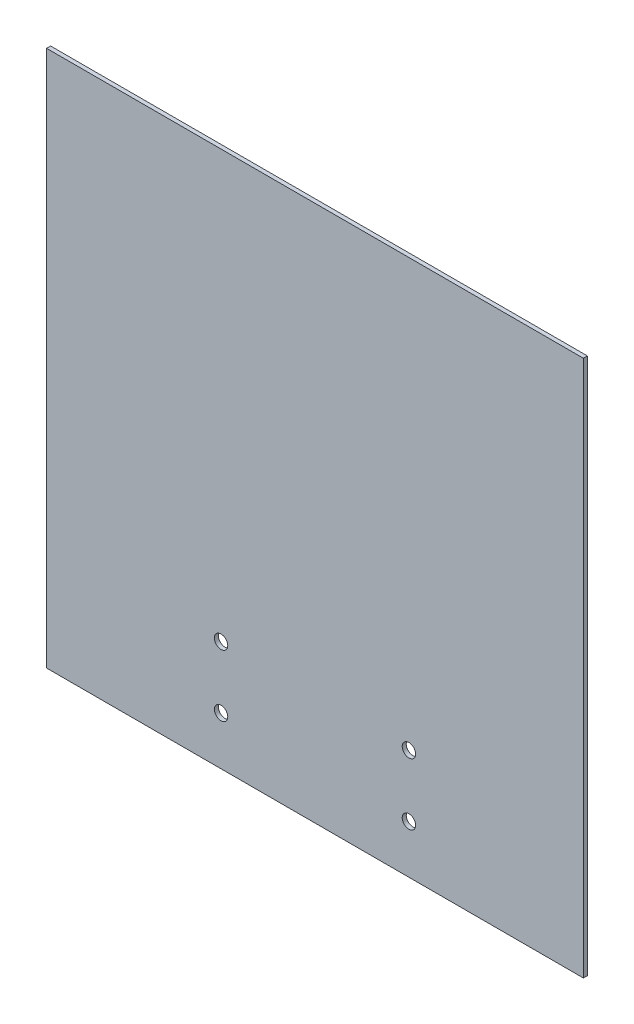
ISO-10303-21;
HEADER;
FILE_DESCRIPTION(('STEP AP214'),'2;1');
FILE_NAME('part.step','',(''),(''),'','','');
FILE_SCHEMA(('AUTOMOTIVE_DESIGN { 1 0 10303 214 1 1 1 1 }'));
ENDSEC;
DATA;
#1=APPLICATION_CONTEXT('core data for automotive mechanical design processes');
#2=APPLICATION_PROTOCOL_DEFINITION('international standard','automotive_design',2000,#1);
#3=PRODUCT_CONTEXT('',#1,'mechanical');
#4=PRODUCT('Part','Part','',(#3));
#5=PRODUCT_RELATED_PRODUCT_CATEGORY('part','',(#4));
#6=PRODUCT_DEFINITION_FORMATION('','',#4);
#7=PRODUCT_DEFINITION_CONTEXT('part definition',#1,'design');
#8=PRODUCT_DEFINITION('design','',#6,#7);
#9=PRODUCT_DEFINITION_SHAPE('','',#8);
#10=(LENGTH_UNIT() NAMED_UNIT(*) SI_UNIT(.MILLI.,.METRE.));
#11=(NAMED_UNIT(*) PLANE_ANGLE_UNIT() SI_UNIT($,.RADIAN.));
#12=(NAMED_UNIT(*) SI_UNIT($,.STERADIAN.) SOLID_ANGLE_UNIT());
#13=UNCERTAINTY_MEASURE_WITH_UNIT(LENGTH_MEASURE(1.E-05),#10,'distance_accuracy_value','');
#14=(GEOMETRIC_REPRESENTATION_CONTEXT(3) GLOBAL_UNCERTAINTY_ASSIGNED_CONTEXT((#13)) GLOBAL_UNIT_ASSIGNED_CONTEXT((#10,
#11,#12)) REPRESENTATION_CONTEXT('',''));
#15=CARTESIAN_POINT('',(0.,0.,0.));
#16=DIRECTION('',(0.,0.,1.));
#17=DIRECTION('',(1.,0.,0.));
#18=AXIS2_PLACEMENT_3D('',#15,#16,#17);
#19=CARTESIAN_POINT('',(100.,-100.,1.5));
#20=DIRECTION('',(-1.,0.,0.));
#21=DIRECTION('',(0.,0.,1.));
#22=AXIS2_PLACEMENT_3D('',#19,#20,#21);
#23=PLANE('',#22);
#24=DIRECTION('',(0.,1.,0.));
#25=VECTOR('',#24,1.);
#26=CARTESIAN_POINT('',(100.,-100.,0.));
#27=LINE('',#26,#25);
#28=CARTESIAN_POINT('',(100.,-100.,0.));
#29=VERTEX_POINT('',#28);
#30=CARTESIAN_POINT('',(100.,100.,0.));
#31=VERTEX_POINT('',#30);
#32=EDGE_CURVE('E106',#29,#31,#27,.T.);
#33=ORIENTED_EDGE('',*,*,#32,.T.);
#34=DIRECTION('',(0.,0.,-1.));
#35=VECTOR('',#34,1.);
#36=CARTESIAN_POINT('',(100.,100.,1.5));
#37=LINE('',#36,#35);
#38=CARTESIAN_POINT('',(100.,100.,1.5));
#39=VERTEX_POINT('',#38);
#40=EDGE_CURVE('E11',#39,#31,#37,.T.);
#41=ORIENTED_EDGE('',*,*,#40,.F.);
#42=DIRECTION('',(0.,1.,0.));
#43=VECTOR('',#42,1.);
#44=CARTESIAN_POINT('',(100.,-100.,1.5));
#45=LINE('',#44,#43);
#46=CARTESIAN_POINT('',(100.,-100.,1.5));
#47=VERTEX_POINT('',#46);
#48=EDGE_CURVE('E90',#47,#39,#45,.T.);
#49=ORIENTED_EDGE('',*,*,#48,.F.);
#50=DIRECTION('',(0.,0.,-1.));
#51=VECTOR('',#50,1.);
#52=CARTESIAN_POINT('',(100.,-100.,1.5));
#53=LINE('',#52,#51);
#54=EDGE_CURVE('E102',#47,#29,#53,.T.);
#55=ORIENTED_EDGE('',*,*,#54,.T.);
#56=EDGE_LOOP('',(#33,#41,#49,#55));
#57=FACE_BOUND('',#56,.T.);
#58=ADVANCED_FACE('F38',(#57),#23,.F.);
#59=CARTESIAN_POINT('',(-100.,100.,1.5));
#60=DIRECTION('',(0.,-1.,0.));
#61=DIRECTION('',(0.,0.,-1.));
#62=AXIS2_PLACEMENT_3D('',#59,#60,#61);
#63=PLANE('',#62);
#64=DIRECTION('',(-1.,0.,0.));
#65=VECTOR('',#64,1.);
#66=CARTESIAN_POINT('',(-100.,100.,0.));
#67=LINE('',#66,#65);
#68=CARTESIAN_POINT('',(-100.,100.,0.));
#69=VERTEX_POINT('',#68);
#70=EDGE_CURVE('E95',#31,#69,#67,.T.);
#71=ORIENTED_EDGE('',*,*,#70,.T.);
#72=DIRECTION('',(0.,0.,-1.));
#73=VECTOR('',#72,1.);
#74=CARTESIAN_POINT('',(-100.,100.,1.5));
#75=LINE('',#74,#73);
#76=CARTESIAN_POINT('',(-100.,100.,1.5));
#77=VERTEX_POINT('',#76);
#78=EDGE_CURVE('E47',#77,#69,#75,.T.);
#79=ORIENTED_EDGE('',*,*,#78,.F.);
#80=DIRECTION('',(-1.,0.,0.));
#81=VECTOR('',#80,1.);
#82=CARTESIAN_POINT('',(-100.,100.,1.5));
#83=LINE('',#82,#81);
#84=EDGE_CURVE('E85',#39,#77,#83,.T.);
#85=ORIENTED_EDGE('',*,*,#84,.F.);
#86=ORIENTED_EDGE('',*,*,#40,.T.);
#87=EDGE_LOOP('',(#71,#79,#85,#86));
#88=FACE_BOUND('',#87,.T.);
#89=ADVANCED_FACE('F94',(#88),#63,.F.);
#90=CARTESIAN_POINT('',(-100.,-100.,1.5));
#91=DIRECTION('',(1.,0.,0.));
#92=DIRECTION('',(0.,0.,-1.));
#93=AXIS2_PLACEMENT_3D('',#90,#91,#92);
#94=PLANE('',#93);
#95=DIRECTION('',(0.,-1.,0.));
#96=VECTOR('',#95,1.);
#97=CARTESIAN_POINT('',(-100.,-100.,0.));
#98=LINE('',#97,#96);
#99=CARTESIAN_POINT('',(-100.,-100.,0.));
#100=VERTEX_POINT('',#99);
#101=EDGE_CURVE('E72',#69,#100,#98,.T.);
#102=ORIENTED_EDGE('',*,*,#101,.T.);
#103=DIRECTION('',(0.,0.,-1.));
#104=VECTOR('',#103,1.);
#105=CARTESIAN_POINT('',(-100.,-100.,1.5));
#106=LINE('',#105,#104);
#107=CARTESIAN_POINT('',(-100.,-100.,1.5));
#108=VERTEX_POINT('',#107);
#109=EDGE_CURVE('E97',#108,#100,#106,.T.);
#110=ORIENTED_EDGE('',*,*,#109,.F.);
#111=DIRECTION('',(0.,-1.,0.));
#112=VECTOR('',#111,1.);
#113=CARTESIAN_POINT('',(-100.,-100.,1.5));
#114=LINE('',#113,#112);
#115=EDGE_CURVE('E88',#77,#108,#114,.T.);
#116=ORIENTED_EDGE('',*,*,#115,.F.);
#117=ORIENTED_EDGE('',*,*,#78,.T.);
#118=EDGE_LOOP('',(#102,#110,#116,#117));
#119=FACE_BOUND('',#118,.T.);
#120=ADVANCED_FACE('F98',(#119),#94,.F.);
#121=CARTESIAN_POINT('',(-100.,-100.,1.5));
#122=DIRECTION('',(0.,1.,0.));
#123=DIRECTION('',(0.,0.,1.));
#124=AXIS2_PLACEMENT_3D('',#121,#122,#123);
#125=PLANE('',#124);
#126=DIRECTION('',(1.,0.,0.));
#127=VECTOR('',#126,1.);
#128=CARTESIAN_POINT('',(-100.,-100.,0.));
#129=LINE('',#128,#127);
#130=EDGE_CURVE('E78',#100,#29,#129,.T.);
#131=ORIENTED_EDGE('',*,*,#130,.T.);
#132=ORIENTED_EDGE('',*,*,#54,.F.);
#133=DIRECTION('',(1.,0.,0.));
#134=VECTOR('',#133,1.);
#135=CARTESIAN_POINT('',(-100.,-100.,1.5));
#136=LINE('',#135,#134);
#137=EDGE_CURVE('E55',#108,#47,#136,.T.);
#138=ORIENTED_EDGE('',*,*,#137,.F.);
#139=ORIENTED_EDGE('',*,*,#109,.T.);
#140=EDGE_LOOP('',(#131,#132,#138,#139));
#141=FACE_BOUND('',#140,.T.);
#142=ADVANCED_FACE('F120',(#141),#125,.F.);
#143=CARTESIAN_POINT('',(0.,0.,1.5));
#144=DIRECTION('',(0.,0.,-1.));
#145=DIRECTION('',(-1.,0.,0.));
#146=AXIS2_PLACEMENT_3D('',#143,#144,#145);
#147=PLANE('',#146);
#148=CARTESIAN_POINT('',(-35.,-59.,1.5));
#149=DIRECTION('',(0.,0.,1.));
#150=DIRECTION('',(1.,0.,0.));
#151=AXIS2_PLACEMENT_3D('',#148,#149,#150);
#152=CIRCLE('',#151,2.5);
#153=CARTESIAN_POINT('',(-32.5,-59.,1.5));
#154=VERTEX_POINT('',#153);
#155=EDGE_CURVE('E144',#154,#154,#152,.T.);
#156=ORIENTED_EDGE('',*,*,#155,.F.);
#157=EDGE_LOOP('',(#156));
#158=FACE_BOUND('',#157,.T.);
#159=CARTESIAN_POINT('',(35.,-82.,1.5));
#160=DIRECTION('',(0.,0.,1.));
#161=DIRECTION('',(-1.,0.,0.));
#162=AXIS2_PLACEMENT_3D('',#159,#160,#161);
#163=CIRCLE('',#162,2.5);
#164=CARTESIAN_POINT('',(32.5,-82.,1.5));
#165=VERTEX_POINT('',#164);
#166=EDGE_CURVE('E135',#165,#165,#163,.T.);
#167=ORIENTED_EDGE('',*,*,#166,.F.);
#168=EDGE_LOOP('',(#167));
#169=FACE_BOUND('',#168,.T.);
#170=CARTESIAN_POINT('',(35.,-59.,1.5));
#171=DIRECTION('',(0.,0.,1.));
#172=DIRECTION('',(-1.,0.,0.));
#173=AXIS2_PLACEMENT_3D('',#170,#171,#172);
#174=CIRCLE('',#173,2.5);
#175=CARTESIAN_POINT('',(32.5,-59.,1.5));
#176=VERTEX_POINT('',#175);
#177=EDGE_CURVE('E151',#176,#176,#174,.T.);
#178=ORIENTED_EDGE('',*,*,#177,.F.);
#179=EDGE_LOOP('',(#178));
#180=FACE_BOUND('',#179,.T.);
#181=CARTESIAN_POINT('',(-35.,-82.,1.5));
#182=DIRECTION('',(0.,0.,1.));
#183=DIRECTION('',(1.,0.,0.));
#184=AXIS2_PLACEMENT_3D('',#181,#182,#183);
#185=CIRCLE('',#184,2.5);
#186=CARTESIAN_POINT('',(-32.5,-82.,1.5));
#187=VERTEX_POINT('',#186);
#188=EDGE_CURVE('E127',#187,#187,#185,.T.);
#189=ORIENTED_EDGE('',*,*,#188,.F.);
#190=EDGE_LOOP('',(#189));
#191=FACE_BOUND('',#190,.T.);
#192=ORIENTED_EDGE('',*,*,#48,.T.);
#193=ORIENTED_EDGE('',*,*,#84,.T.);
#194=ORIENTED_EDGE('',*,*,#115,.T.);
#195=ORIENTED_EDGE('',*,*,#137,.T.);
#196=EDGE_LOOP('',(#192,#193,#194,#195));
#197=FACE_BOUND('',#196,.T.);
#198=ADVANCED_FACE('F86',(#158,#169,#180,#191,#197),#147,.F.);
#199=CARTESIAN_POINT('',(0.,0.,0.));
#200=DIRECTION('',(0.,0.,-1.));
#201=DIRECTION('',(-1.,0.,0.));
#202=AXIS2_PLACEMENT_3D('',#199,#200,#201);
#203=PLANE('',#202);
#204=CARTESIAN_POINT('',(-35.,-59.,0.));
#205=DIRECTION('',(0.,0.,1.));
#206=DIRECTION('',(1.,0.,0.));
#207=AXIS2_PLACEMENT_3D('',#204,#205,#206);
#208=CIRCLE('',#207,2.5);
#209=CARTESIAN_POINT('',(-32.5,-59.,0.));
#210=VERTEX_POINT('',#209);
#211=EDGE_CURVE('E131',#210,#210,#208,.T.);
#212=ORIENTED_EDGE('',*,*,#211,.T.);
#213=EDGE_LOOP('',(#212));
#214=FACE_BOUND('',#213,.T.);
#215=CARTESIAN_POINT('',(35.,-82.,0.));
#216=DIRECTION('',(0.,0.,1.));
#217=DIRECTION('',(-1.,0.,0.));
#218=AXIS2_PLACEMENT_3D('',#215,#216,#217);
#219=CIRCLE('',#218,2.5);
#220=CARTESIAN_POINT('',(32.5,-82.,0.));
#221=VERTEX_POINT('',#220);
#222=EDGE_CURVE('E139',#221,#221,#219,.T.);
#223=ORIENTED_EDGE('',*,*,#222,.T.);
#224=EDGE_LOOP('',(#223));
#225=FACE_BOUND('',#224,.T.);
#226=CARTESIAN_POINT('',(35.,-59.,0.));
#227=DIRECTION('',(0.,0.,1.));
#228=DIRECTION('',(-1.,0.,0.));
#229=AXIS2_PLACEMENT_3D('',#226,#227,#228);
#230=CIRCLE('',#229,2.5);
#231=CARTESIAN_POINT('',(32.5,-59.,0.));
#232=VERTEX_POINT('',#231);
#233=EDGE_CURVE('E140',#232,#232,#230,.T.);
#234=ORIENTED_EDGE('',*,*,#233,.T.);
#235=EDGE_LOOP('',(#234));
#236=FACE_BOUND('',#235,.T.);
#237=CARTESIAN_POINT('',(-35.,-82.,0.));
#238=DIRECTION('',(0.,0.,1.));
#239=DIRECTION('',(1.,0.,0.));
#240=AXIS2_PLACEMENT_3D('',#237,#238,#239);
#241=CIRCLE('',#240,2.5);
#242=CARTESIAN_POINT('',(-32.5,-82.,0.));
#243=VERTEX_POINT('',#242);
#244=EDGE_CURVE('E110',#243,#243,#241,.T.);
#245=ORIENTED_EDGE('',*,*,#244,.T.);
#246=EDGE_LOOP('',(#245));
#247=FACE_BOUND('',#246,.T.);
#248=ORIENTED_EDGE('',*,*,#32,.F.);
#249=ORIENTED_EDGE('',*,*,#130,.F.);
#250=ORIENTED_EDGE('',*,*,#101,.F.);
#251=ORIENTED_EDGE('',*,*,#70,.F.);
#252=EDGE_LOOP('',(#248,#249,#250,#251));
#253=FACE_BOUND('',#252,.T.);
#254=ADVANCED_FACE('F123',(#214,#225,#236,#247,#253),#203,.T.);
#255=CARTESIAN_POINT('',(-35.,-82.,0.));
#256=DIRECTION('',(0.,0.,1.));
#257=DIRECTION('',(1.,0.,0.));
#258=AXIS2_PLACEMENT_3D('',#255,#256,#257);
#259=CYLINDRICAL_SURFACE('',#258,2.5);
#260=ORIENTED_EDGE('',*,*,#244,.F.);
#261=EDGE_LOOP('',(#260));
#262=FACE_BOUND('',#261,.T.);
#263=ORIENTED_EDGE('',*,*,#188,.T.);
#264=EDGE_LOOP('',(#263));
#265=FACE_BOUND('',#264,.T.);
#266=ADVANCED_FACE('F165',(#262,#265),#259,.F.);
#267=CARTESIAN_POINT('',(35.,-59.,0.));
#268=DIRECTION('',(0.,0.,1.));
#269=DIRECTION('',(1.,0.,0.));
#270=AXIS2_PLACEMENT_3D('',#267,#268,#269);
#271=CYLINDRICAL_SURFACE('',#270,2.5);
#272=ORIENTED_EDGE('',*,*,#233,.F.);
#273=EDGE_LOOP('',(#272));
#274=FACE_BOUND('',#273,.T.);
#275=ORIENTED_EDGE('',*,*,#177,.T.);
#276=EDGE_LOOP('',(#275));
#277=FACE_BOUND('',#276,.T.);
#278=ADVANCED_FACE('F161',(#274,#277),#271,.F.);
#279=CARTESIAN_POINT('',(35.,-82.,0.));
#280=DIRECTION('',(0.,0.,1.));
#281=DIRECTION('',(1.,0.,0.));
#282=AXIS2_PLACEMENT_3D('',#279,#280,#281);
#283=CYLINDRICAL_SURFACE('',#282,2.5);
#284=ORIENTED_EDGE('',*,*,#222,.F.);
#285=EDGE_LOOP('',(#284));
#286=FACE_BOUND('',#285,.T.);
#287=ORIENTED_EDGE('',*,*,#166,.T.);
#288=EDGE_LOOP('',(#287));
#289=FACE_BOUND('',#288,.T.);
#290=ADVANCED_FACE('F164',(#286,#289),#283,.F.);
#291=CARTESIAN_POINT('',(-35.,-59.,0.));
#292=DIRECTION('',(0.,0.,1.));
#293=DIRECTION('',(1.,0.,0.));
#294=AXIS2_PLACEMENT_3D('',#291,#292,#293);
#295=CYLINDRICAL_SURFACE('',#294,2.5);
#296=ORIENTED_EDGE('',*,*,#211,.F.);
#297=EDGE_LOOP('',(#296));
#298=FACE_BOUND('',#297,.T.);
#299=ORIENTED_EDGE('',*,*,#155,.T.);
#300=EDGE_LOOP('',(#299));
#301=FACE_BOUND('',#300,.T.);
#302=ADVANCED_FACE('F228',(#298,#301),#295,.F.);
#303=CLOSED_SHELL('',(#58,#89,#120,#142,#198,#254,#266,#278,#290,#302));
#304=MANIFOLD_SOLID_BREP('B2',#303);
#305=ADVANCED_BREP_SHAPE_REPRESENTATION('',(#18,#304),#14);
#306=SHAPE_DEFINITION_REPRESENTATION(#9,#305);
ENDSEC;
END-ISO-10303-21;
